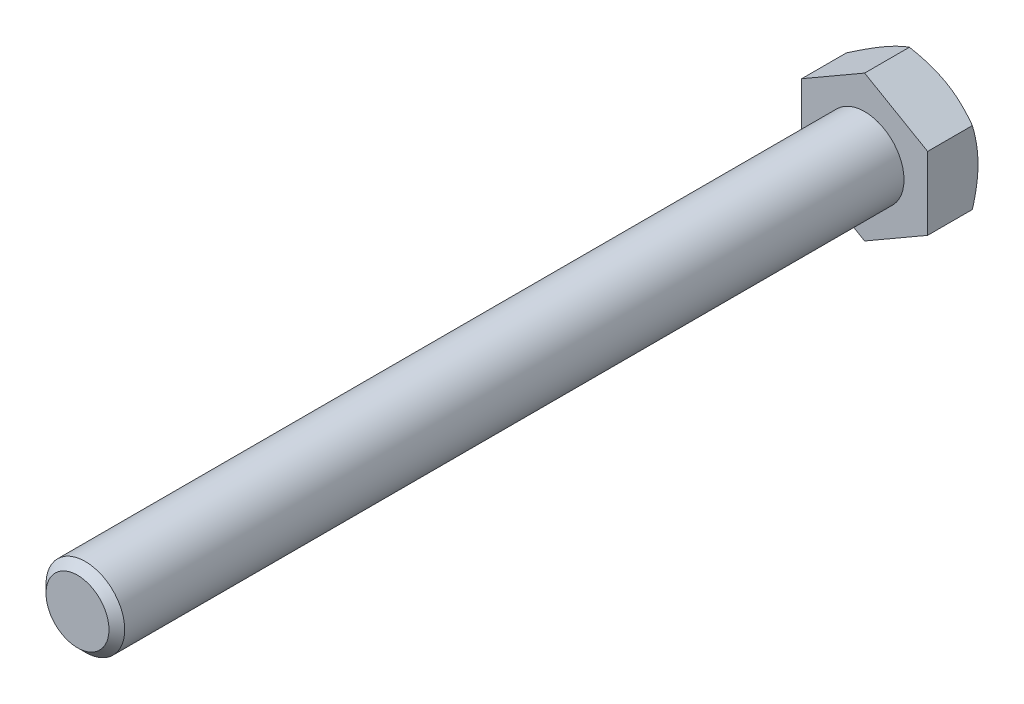
ISO-10303-21;
HEADER;
FILE_DESCRIPTION(('STEP AP214'),'2;1');
FILE_NAME('part.step','',(''),(''),'','','');
FILE_SCHEMA(('AUTOMOTIVE_DESIGN { 1 0 10303 214 1 1 1 1 }'));
ENDSEC;
DATA;
#1=APPLICATION_CONTEXT('core data for automotive mechanical design processes');
#2=APPLICATION_PROTOCOL_DEFINITION('international standard','automotive_design',2000,#1);
#3=PRODUCT_CONTEXT('',#1,'mechanical');
#4=PRODUCT('Part','Part','',(#3));
#5=PRODUCT_RELATED_PRODUCT_CATEGORY('part','',(#4));
#6=PRODUCT_DEFINITION_FORMATION('','',#4);
#7=PRODUCT_DEFINITION_CONTEXT('part definition',#1,'design');
#8=PRODUCT_DEFINITION('design','',#6,#7);
#9=PRODUCT_DEFINITION_SHAPE('','',#8);
#10=(LENGTH_UNIT() NAMED_UNIT(*) SI_UNIT(.MILLI.,.METRE.));
#11=(NAMED_UNIT(*) PLANE_ANGLE_UNIT() SI_UNIT($,.RADIAN.));
#12=(NAMED_UNIT(*) SI_UNIT($,.STERADIAN.) SOLID_ANGLE_UNIT());
#13=UNCERTAINTY_MEASURE_WITH_UNIT(LENGTH_MEASURE(1.E-05),#10,'distance_accuracy_value','');
#14=(GEOMETRIC_REPRESENTATION_CONTEXT(3) GLOBAL_UNCERTAINTY_ASSIGNED_CONTEXT((#13)) GLOBAL_UNIT_ASSIGNED_CONTEXT((#10,
#11,#12)) REPRESENTATION_CONTEXT('',''));
#15=CARTESIAN_POINT('',(0.,0.,0.));
#16=DIRECTION('',(0.,0.,1.));
#17=DIRECTION('',(1.,0.,0.));
#18=AXIS2_PLACEMENT_3D('',#15,#16,#17);
#19=CARTESIAN_POINT('',(0.,-1.2490009027033E-13,100.));
#20=DIRECTION('',(0.,0.,1.));
#21=DIRECTION('',(1.,0.,0.));
#22=AXIS2_PLACEMENT_3D('',#19,#20,#21);
#23=PLANE('',#22);
#24=CARTESIAN_POINT('',(0.,-1.2490009027033E-13,100.));
#25=DIRECTION('',(0.,0.,1.));
#26=DIRECTION('',(1.,0.,0.));
#27=AXIS2_PLACEMENT_3D('',#24,#25,#26);
#28=CIRCLE('',#27,3.99999999999998);
#29=CARTESIAN_POINT('',(4.00000000000006,-1.2490009027033E-13,100.));
#30=VERTEX_POINT('',#29);
#31=EDGE_CURVE('E205',#30,#30,#28,.T.);
#32=ORIENTED_EDGE('',*,*,#31,.T.);
#33=EDGE_LOOP('',(#32));
#34=FACE_BOUND('',#33,.T.);
#35=ADVANCED_FACE('F31',(#34),#23,.T.);
#36=CARTESIAN_POINT('',(0.,0.,0.));
#37=DIRECTION('',(0.,0.,1.));
#38=DIRECTION('',(1.,0.,0.));
#39=AXIS2_PLACEMENT_3D('',#36,#37,#38);
#40=CYLINDRICAL_SURFACE('',#39,5.);
#41=CARTESIAN_POINT('',(0.,-1.2490009027033E-13,99.));
#42=DIRECTION('',(0.,0.,1.));
#43=DIRECTION('',(1.,0.,0.));
#44=AXIS2_PLACEMENT_3D('',#41,#42,#43);
#45=CIRCLE('',#44,5.);
#46=CARTESIAN_POINT('',(5.00000000000008,-1.2490009027033E-13,99.));
#47=VERTEX_POINT('',#46);
#48=EDGE_CURVE('E207',#47,#47,#45,.F.);
#49=ORIENTED_EDGE('',*,*,#48,.T.);
#50=EDGE_LOOP('',(#49));
#51=FACE_BOUND('',#50,.T.);
#52=CARTESIAN_POINT('',(0.,0.,0.));
#53=DIRECTION('',(0.,0.,1.));
#54=DIRECTION('',(1.,0.,0.));
#55=AXIS2_PLACEMENT_3D('',#52,#53,#54);
#56=CIRCLE('',#55,5.);
#57=CARTESIAN_POINT('',(5.00000000000002,0.,0.));
#58=VERTEX_POINT('',#57);
#59=EDGE_CURVE('E208',#58,#58,#56,.F.);
#60=ORIENTED_EDGE('',*,*,#59,.F.);
#61=EDGE_LOOP('',(#60));
#62=FACE_BOUND('',#61,.T.);
#63=ADVANCED_FACE('F196',(#51,#62),#40,.T.);
#64=CARTESIAN_POINT('',(0.,-1.2490009027033E-13,100.));
#65=DIRECTION('',(0.,0.,-1.));
#66=DIRECTION('',(-1.,0.,0.));
#67=AXIS2_PLACEMENT_3D('',#64,#65,#66);
#68=CONICAL_SURFACE('',#67,3.99999999999998,0.785398163397457);
#69=ORIENTED_EDGE('',*,*,#48,.F.);
#70=EDGE_LOOP('',(#69));
#71=FACE_BOUND('',#70,.T.);
#72=ORIENTED_EDGE('',*,*,#31,.F.);
#73=EDGE_LOOP('',(#72));
#74=FACE_BOUND('',#73,.T.);
#75=ADVANCED_FACE('F201',(#71,#74),#68,.T.);
#76=CARTESIAN_POINT('',(0.,9.23760430703405,-6.4));
#77=DIRECTION('',(0.5,0.866025403784442,0.));
#78=DIRECTION('',(-0.866025403784443,0.499999999999999,0.));
#79=AXIS2_PLACEMENT_3D('',#76,#77,#78);
#80=PLANE('',#79);
#81=CARTESIAN_POINT('',(-0.000199999999939832,9.23771977708791,-5.68540215226701));
#82=CARTESIAN_POINT('',(0.175648783879935,9.13619343437815,-5.74400928595268));
#83=CARTESIAN_POINT('',(0.352153194306164,9.03428856550539,-5.79995659895269));
#84=CARTESIAN_POINT('',(0.706595462878481,8.82965122633297,-5.90579899497531));
#85=CARTESIAN_POINT('',(0.884533904692736,8.72691841905233,-5.95569146556891));
#86=CARTESIAN_POINT('',(1.42119823762267,8.41707512197077,-6.09530720279312));
#87=CARTESIAN_POINT('',(1.78204258223575,8.20874154247285,-6.17471882902161));
#88=CARTESIAN_POINT('',(2.32203917020408,7.89697436704786,-6.26783835370549));
#89=CARTESIAN_POINT('',(2.49957818964331,7.79447216638295,-6.29436541897085));
#90=CARTESIAN_POINT('',(2.85545911296023,7.58900421950648,-6.3388468251411));
#91=CARTESIAN_POINT('',(3.03380094449327,7.48603851506312,-6.3568019234854));
#92=CARTESIAN_POINT('',(3.39079168482362,7.27992981503517,-6.38368435150811));
#93=CARTESIAN_POINT('',(3.56944001360952,7.17678715432034,-6.39262192645374));
#94=CARTESIAN_POINT('',(3.92690170509742,6.97040655051487,-6.40127769603485));
#95=CARTESIAN_POINT('',(4.10571506253012,6.86716861046645,-6.40099617549715));
#96=CARTESIAN_POINT('',(4.44001336701696,6.67416139438134,-6.39185497473122));
#97=CARTESIAN_POINT('',(4.5955219043387,6.58437849849729,-6.38411039563262));
#98=CARTESIAN_POINT('',(4.90617476174053,6.40502298765179,-6.36179886514654));
#99=CARTESIAN_POINT('',(5.06131905656002,6.31545038727453,-6.34723145386183));
#100=CARTESIAN_POINT('',(5.52615131589485,6.04707935721957,-6.29363930947244));
#101=CARTESIAN_POINT('',(5.83501648718175,5.86875596743377,-6.24473135833083));
#102=CARTESIAN_POINT('',(6.45602322876033,5.51021755801479,-6.12246059676566));
#103=CARTESIAN_POINT('',(6.76808554211451,5.33004829739582,-6.04857947962397));
#104=CARTESIAN_POINT('',(7.38755648169481,4.972396583674,-5.880899858745));
#105=CARTESIAN_POINT('',(7.69497304089181,4.79490955046829,-5.78714073914552));
#106=CARTESIAN_POINT('',(8.00020000000009,4.61868668346324,-5.68540215226701));
#107=B_SPLINE_CURVE_WITH_KNOTS('',3,(#81,#82,#83,#84,#85,#86,#87,#88,#89,#90,#91,#92,#93,#94,
#95,#96,#97,#98,#99,#100,#101,#102,#103,#104,#105,#106),.UNSPECIFIED.,.F.,.F.,(4,2,2,2,2,2,2,2,
2,2,2,2,4),(0.,0.633973543721348,1.26821965714356,2.53934712434765,3.15934343977048,
3.77928496069783,4.39852133866765,5.01773858515594,5.55680239410248,6.09590254421147,
7.17487077411834,8.27776850154293,9.37850115249056),.UNSPECIFIED.);
#108=CARTESIAN_POINT('',(0.,9.23760430703405,-5.68546882018367));
#109=VERTEX_POINT('',#108);
#110=CARTESIAN_POINT('',(4.00000000000004,6.92820323027554,-6.4));
#111=VERTEX_POINT('',#110);
#112=EDGE_CURVE('E241',#109,#111,#107,.T.);
#113=ORIENTED_EDGE('',*,*,#112,.F.);
#114=DIRECTION('',(0.,0.,1.));
#115=VECTOR('',#114,1.);
#116=CARTESIAN_POINT('',(0.,9.23760430703405,-6.4));
#117=LINE('',#116,#115);
#118=CARTESIAN_POINT('',(0.,9.23760430703405,0.));
#119=VERTEX_POINT('',#118);
#120=EDGE_CURVE('E215',#109,#119,#117,.T.);
#121=ORIENTED_EDGE('',*,*,#120,.T.);
#122=DIRECTION('',(-0.866025403784443,0.499999999999999,0.));
#123=VECTOR('',#122,1.);
#124=CARTESIAN_POINT('',(0.,9.23760430703405,0.));
#125=LINE('',#124,#123);
#126=CARTESIAN_POINT('',(8.00000000000007,4.61880215351709,0.));
#127=VERTEX_POINT('',#126);
#128=EDGE_CURVE('E239',#127,#119,#125,.T.);
#129=ORIENTED_EDGE('',*,*,#128,.F.);
#130=DIRECTION('',(0.,0.,1.));
#131=VECTOR('',#130,1.);
#132=CARTESIAN_POINT('',(8.00000000000004,4.61880215351707,-6.39999999999999));
#133=LINE('',#132,#131);
#134=CARTESIAN_POINT('',(8.00000000000003,4.61880215351705,-5.68546882018366));
#135=VERTEX_POINT('',#134);
#136=EDGE_CURVE('E212',#135,#127,#133,.T.);
#137=ORIENTED_EDGE('',*,*,#136,.F.);
#138=EDGE_CURVE('E171',#111,#135,#107,.T.);
#139=ORIENTED_EDGE('',*,*,#138,.F.);
#140=EDGE_LOOP('',(#113,#121,#129,#137,#139));
#141=FACE_BOUND('',#140,.T.);
#142=ADVANCED_FACE('F181',(#141),#80,.T.);
#143=CARTESIAN_POINT('',(8.,-4.61880215351702,-6.39999999999992));
#144=DIRECTION('',(1.,0.,0.));
#145=DIRECTION('',(0.,0.,-1.));
#146=AXIS2_PLACEMENT_3D('',#143,#144,#145);
#147=PLANE('',#146);
#148=CARTESIAN_POINT('',(8.00000000000009,-12.5978512302027,-2.40281206496025));
#149=CARTESIAN_POINT('',(8.00000000000003,-12.246746193335,-2.57388946423494));
#150=CARTESIAN_POINT('',(8.00000000000001,-11.8948553361064,-2.74338074230881));
#151=CARTESIAN_POINT('',(7.99999999999999,-11.1890846886661,-3.07830251110038));
#152=CARTESIAN_POINT('',(8.,-10.835204611765,-3.24373239703251));
#153=CARTESIAN_POINT('',(8.,-10.1233054863219,-3.57043443638573));
#154=CARTESIAN_POINT('',(8.,-9.76527449682906,-3.73168065672867));
#155=CARTESIAN_POINT('',(8.,-9.04643054583632,-4.04782365286064));
#156=CARTESIAN_POINT('',(8.,-8.68561771136528,-4.20272071655814));
#157=CARTESIAN_POINT('',(8.,-7.94836823401665,-4.50960168843216));
#158=CARTESIAN_POINT('',(8.,-7.57181608867651,-4.66130959920928));
#159=CARTESIAN_POINT('',(8.,-6.8143786958222,-4.95369969756663));
#160=CARTESIAN_POINT('',(8.,-6.43349297805852,-5.0943806752572));
#161=CARTESIAN_POINT('',(7.99999999999999,-5.66743059798481,-5.36116349536506));
#162=CARTESIAN_POINT('',(7.99999999999998,-5.28226375872603,-5.48729325010826));
#163=CARTESIAN_POINT('',(8.00000000000002,-4.50642197899134,-5.72105487356285));
#164=CARTESIAN_POINT('',(8.00000000000007,-4.11574875302434,-5.82869236825172));
#165=CARTESIAN_POINT('',(8.00000000000007,-3.33076858815041,-6.01985550727007));
#166=CARTESIAN_POINT('',(8.00000000000001,-2.93649538955179,-6.10351603835958));
#167=CARTESIAN_POINT('',(7.99999999999999,-2.34134760728193,-6.20749259694592));
#168=CARTESIAN_POINT('',(8.,-2.14232908008158,-6.23856705157576));
#169=CARTESIAN_POINT('',(8.,-1.74323916388526,-6.29294025453344));
#170=CARTESIAN_POINT('',(8.,-1.5431678791364,-6.31623975857019));
#171=CARTESIAN_POINT('',(8.,-1.14493807260304,-6.35429623361987));
#172=CARTESIAN_POINT('',(8.,-0.946790216902606,-6.36916434005902));
#173=CARTESIAN_POINT('',(8.,-0.550042658772934,-6.39050002577556));
#174=CARTESIAN_POINT('',(8.,-0.351442964201984,-6.39696775004869));
#175=CARTESIAN_POINT('',(7.99999999999999,0.0458536813574681,-6.40134753654392));
#176=CARTESIAN_POINT('',(7.99999999999998,0.244550632880976,-6.39925955116046));
#177=CARTESIAN_POINT('',(8.00000000000001,0.641675332001835,-6.38658102386361));
#178=CARTESIAN_POINT('',(8.00000000000006,0.840103066876735,-6.37599009324409));
#179=CARTESIAN_POINT('',(8.00000000000008,1.31123186508482,-6.3409781073635));
#180=CARTESIAN_POINT('',(8.00000000000002,1.58366327386952,-6.31284309148416));
#181=CARTESIAN_POINT('',(7.99999999999998,2.12661564573494,-6.24203710559683));
#182=CARTESIAN_POINT('',(7.99999999999999,2.39713636619096,-6.1993643222489));
#183=CARTESIAN_POINT('',(8.00000000000001,3.20545284137287,-6.05179305178878));
#184=CARTESIAN_POINT('',(8.,3.73973646457266,-5.92736416459607));
#185=CARTESIAN_POINT('',(8.,4.53906436560802,-5.71012995228711));
#186=CARTESIAN_POINT('',(8.,4.80821183359779,-5.63154182973881));
#187=CARTESIAN_POINT('',(8.,5.34389592451212,-5.46584170055405));
#188=CARTESIAN_POINT('',(8.,5.61043252727899,-5.37872962816376));
#189=CARTESIAN_POINT('',(7.99999999999999,6.14097486865214,-5.19740915600457));
#190=CARTESIAN_POINT('',(7.99999999999998,6.40498129578467,-5.10320275237941));
#191=CARTESIAN_POINT('',(8.00000000000001,6.93077992716971,-4.90883812520454));
#192=CARTESIAN_POINT('',(8.00000000000006,7.1925721821315,-4.80868003838509));
#193=CARTESIAN_POINT('',(8.00000000000009,7.89757234436713,-4.53123135388026));
#194=CARTESIAN_POINT('',(8.00000000000002,8.33892089987198,-4.34922056511974));
#195=CARTESIAN_POINT('',(7.99999999999997,9.21706508189068,-3.97449001059298));
#196=CARTESIAN_POINT('',(7.99999999999999,9.65386019466895,-3.78176905166925));
#197=CARTESIAN_POINT('',(8.00000000000001,10.5239434374362,-3.38815487772953));
#198=CARTESIAN_POINT('',(8.,10.9572301479344,-3.18725853544569));
#199=CARTESIAN_POINT('',(8.,11.8208356781986,-2.77925077908642));
#200=CARTESIAN_POINT('',(8.,12.2511546186011,-2.57213961948964));
#201=CARTESIAN_POINT('',(8.,13.1101061451691,-2.15271844372303));
#202=CARTESIAN_POINT('',(8.,13.5387348916149,-1.9404005805941));
#203=CARTESIAN_POINT('',(8.,14.3940561255566,-1.51189757696327));
#204=CARTESIAN_POINT('',(8.,14.8207485968081,-1.29571240409163));
#205=CARTESIAN_POINT('',(8.,15.6724483801741,-0.86028346815875));
#206=CARTESIAN_POINT('',(8.,16.0974560462025,-0.641040396526408));
#207=CARTESIAN_POINT('',(8.,16.9461557859949,-0.200021087699503));
#208=CARTESIAN_POINT('',(8.,17.3698478544563,0.0217551596884403));
#209=CARTESIAN_POINT('',(8.,18.5495919939928,0.642968734562609));
#210=CARTESIAN_POINT('',(8.,19.3044430685455,1.04468640301358));
#211=CARTESIAN_POINT('',(8.,20.8116128705592,1.85294502935702));
#212=CARTESIAN_POINT('',(7.99999999999999,21.563931437839,2.25948628524755));
#213=CARTESIAN_POINT('',(8.,23.064082553762,3.07479055108809));
#214=CARTESIAN_POINT('',(8.,23.8119216778553,3.48354147008009));
#215=CARTESIAN_POINT('',(7.99999999999999,24.9325210040827,4.09870759670387));
#216=CARTESIAN_POINT('',(7.99999999999999,25.3058462727559,4.30409483812582));
#217=CARTESIAN_POINT('',(8.,26.0521604299717,4.71547851410467));
#218=CARTESIAN_POINT('',(8.00000000000002,26.4251493189334,4.92147494790111));
#219=CARTESIAN_POINT('',(8.00000000000007,26.7979906098644,5.12773824710108));
#220=B_SPLINE_CURVE_WITH_KNOTS('',3,(#148,#149,#150,#151,#152,#153,#154,#155,#156,#157,#158,
#159,#160,#161,#162,#163,#164,#165,#166,#167,#168,#169,#170,#171,#172,#173,#174,#175,#176,#177,
#178,#179,#180,#181,#182,#183,#184,#185,#186,#187,#188,#189,#190,#191,#192,#193,#194,#195,#196,
#197,#198,#199,#200,#201,#202,#203,#204,#205,#206,#207,#208,#209,#210,#211,#212,#213,#214,#215,
#216,#217,#218,#219),.UNSPECIFIED.,.F.,.F.,(4,2,2,2,2,2,2,2,2,2,2,2,2,2,2,2,2,2,2,2,2,2,2,2,2,2,
2,2,2,2,2,2,2,2,2,4),(0.,1.17171303757608,2.34359951048674,3.52154779988271,4.69944261487827,
5.91720060182579,7.13509201629463,8.35060698423298,9.56575149358515,10.7739194195453,
11.3780811947188,11.982184229517,12.5781274788068,13.1740604416141,13.7699967203082,
14.3659602433607,15.1871414998263,16.0084252222518,17.651791220792,18.4928743658415,
19.3339639995265,20.1748178523692,21.0156523954213,22.4476587813298,23.87982501976,
25.312544340616,26.7452050756368,28.1801767110294,29.6151603628914,31.0498246444422,
32.48449470105,35.0497345139727,37.6151336395593,40.171894300576,41.4501744055995,
42.7284529156065),.UNSPECIFIED.);
#221=CARTESIAN_POINT('',(7.99999999999999,0.,-6.4));
#222=VERTEX_POINT('',#221);
#223=EDGE_CURVE('E169',#135,#222,#220,.F.);
#224=ORIENTED_EDGE('',*,*,#223,.F.);
#225=ORIENTED_EDGE('',*,*,#136,.T.);
#226=DIRECTION('',(0.,1.,0.));
#227=VECTOR('',#226,1.);
#228=CARTESIAN_POINT('',(8.00000000000008,-4.61880215351705,0.));
#229=LINE('',#228,#227);
#230=CARTESIAN_POINT('',(8.00000000000008,-4.61880215351705,0.));
#231=VERTEX_POINT('',#230);
#232=EDGE_CURVE('E217',#231,#127,#229,.T.);
#233=ORIENTED_EDGE('',*,*,#232,.F.);
#234=DIRECTION('',(0.,0.,1.));
#235=VECTOR('',#234,1.);
#236=CARTESIAN_POINT('',(8.,-4.61880215351702,-6.39999999999992));
#237=LINE('',#236,#235);
#238=CARTESIAN_POINT('',(8.,-4.61880215351702,-5.68546882018359));
#239=VERTEX_POINT('',#238);
#240=EDGE_CURVE('E223',#239,#231,#237,.T.);
#241=ORIENTED_EDGE('',*,*,#240,.F.);
#242=EDGE_CURVE('E164',#222,#239,#220,.F.);
#243=ORIENTED_EDGE('',*,*,#242,.F.);
#244=EDGE_LOOP('',(#224,#225,#233,#241,#243));
#245=FACE_BOUND('',#244,.T.);
#246=ADVANCED_FACE('F177',(#245),#147,.T.);
#247=CARTESIAN_POINT('',(0.,-9.23760430703401,-6.39999999999993));
#248=DIRECTION('',(0.499999999999999,-0.866025403784442,0.));
#249=DIRECTION('',(0.866025403784443,0.499999999999999,0.));
#250=AXIS2_PLACEMENT_3D('',#247,#248,#249);
#251=PLANE('',#250);
#252=CARTESIAN_POINT('',(8.00020000000009,-4.61868668346313,-5.68540215226694));
#253=CARTESIAN_POINT('',(7.82435121612019,-4.72021302617284,-5.74400928595265));
#254=CARTESIAN_POINT('',(7.64784680569395,-4.82211789504558,-5.79995659895268));
#255=CARTESIAN_POINT('',(7.29340453712163,-5.02675523421799,-5.90579899497532));
#256=CARTESIAN_POINT('',(7.11546609530737,-5.12948804149864,-5.95569146556892));
#257=CARTESIAN_POINT('',(6.57880176237744,-5.43933133858021,-6.09530720279312));
#258=CARTESIAN_POINT('',(6.21795741776436,-5.64766491807812,-6.17471882902162));
#259=CARTESIAN_POINT('',(5.67796082979603,-5.95943209350311,-6.26783835370551));
#260=CARTESIAN_POINT('',(5.50042181035679,-6.06193429416802,-6.29436541897088));
#261=CARTESIAN_POINT('',(5.14454088703988,-6.26740224104449,-6.33884682514113));
#262=CARTESIAN_POINT('',(4.96619905550684,-6.37036794548786,-6.35680192348542));
#263=CARTESIAN_POINT('',(4.60920831517648,-6.5764766455158,-6.38368435150815));
#264=CARTESIAN_POINT('',(4.43055998639057,-6.67961930623062,-6.3926219264538));
#265=CARTESIAN_POINT('',(4.07309829490268,-6.88599991003612,-6.40127769603486));
#266=CARTESIAN_POINT('',(3.89428493746999,-6.98923785008458,-6.40099617549707));
#267=CARTESIAN_POINT('',(3.55998663298314,-7.1822450661697,-6.39185497473116));
#268=CARTESIAN_POINT('',(3.40447809566137,-7.27202796205371,-6.38411039563263));
#269=CARTESIAN_POINT('',(3.09382523825952,-7.4513834728992,-6.36179886514661));
#270=CARTESIAN_POINT('',(2.93868094344002,-7.54095607327647,-6.34723145386188));
#271=CARTESIAN_POINT('',(2.47384868410519,-7.80932710333146,-6.29363930947247));
#272=CARTESIAN_POINT('',(2.16498351281827,-7.98765049311726,-6.24473135833087));
#273=CARTESIAN_POINT('',(1.54397677123967,-8.34618890253623,-6.12246059676571));
#274=CARTESIAN_POINT('',(1.23191445788548,-8.52635816315521,-6.04857947962402));
#275=CARTESIAN_POINT('',(0.61244351830518,-8.88400987687705,-5.88089985874502));
#276=CARTESIAN_POINT('',(0.305026959108186,-9.0614969100828,-5.78714073914551));
#277=CARTESIAN_POINT('',(-0.000200000000047384,-9.23771977708791,-5.68540215226694));
#278=B_SPLINE_CURVE_WITH_KNOTS('',3,(#252,#253,#254,#255,#256,#257,#258,#259,#260,#261,#262,
#263,#264,#265,#266,#267,#268,#269,#270,#271,#272,#273,#274,#275,#276,#277),.UNSPECIFIED.,.F.,
.F.,(4,2,2,2,2,2,2,2,2,2,2,2,4),(0.,0.63397354372136,1.26821965714358,2.53934712434767,
3.15934343977051,3.77928496069786,4.39852133866769,5.01773858515599,5.55680239410255,
6.09590254421156,7.17487077411847,8.27776850154309,9.37850115249076),.UNSPECIFIED.);
#279=CARTESIAN_POINT('',(4.00000000000005,-6.92820323027551,-6.39999999999993));
#280=VERTEX_POINT('',#279);
#281=EDGE_CURVE('E170',#239,#280,#278,.T.);
#282=ORIENTED_EDGE('',*,*,#281,.F.);
#283=ORIENTED_EDGE('',*,*,#240,.T.);
#284=DIRECTION('',(0.866025403784443,0.499999999999999,0.));
#285=VECTOR('',#284,1.);
#286=CARTESIAN_POINT('',(0.,-9.23760430703401,0.));
#287=LINE('',#286,#285);
#288=CARTESIAN_POINT('',(0.,-9.23760430703401,0.));
#289=VERTEX_POINT('',#288);
#290=EDGE_CURVE('E228',#289,#231,#287,.T.);
#291=ORIENTED_EDGE('',*,*,#290,.F.);
#292=DIRECTION('',(0.,0.,1.));
#293=VECTOR('',#292,1.);
#294=CARTESIAN_POINT('',(0.,-9.23760430703401,-6.39999999999993));
#295=LINE('',#294,#293);
#296=CARTESIAN_POINT('',(0.,-9.23760430703401,-5.6854688201836));
#297=VERTEX_POINT('',#296);
#298=EDGE_CURVE('E221',#297,#289,#295,.T.);
#299=ORIENTED_EDGE('',*,*,#298,.F.);
#300=EDGE_CURVE('E158',#280,#297,#278,.T.);
#301=ORIENTED_EDGE('',*,*,#300,.F.);
#302=EDGE_LOOP('',(#282,#283,#291,#299,#301));
#303=FACE_BOUND('',#302,.T.);
#304=ADVANCED_FACE('F180',(#303),#251,.T.);
#305=CARTESIAN_POINT('',(0.,-9.23760430703401,-6.39999999999993));
#306=DIRECTION('',(-0.500000000000003,-0.86602540378444,0.));
#307=DIRECTION('',(0.866025403784441,-0.500000000000003,0.));
#308=AXIS2_PLACEMENT_3D('',#305,#306,#307);
#309=PLANE('',#308);
#310=CARTESIAN_POINT('',(0.000200000000024833,-9.23771977708782,-5.68540215226694));
#311=CARTESIAN_POINT('',(-0.17564878387988,-9.13619343437812,-5.74400928595266));
#312=CARTESIAN_POINT('',(-0.352153194306124,-9.03428856550539,-5.79995659895269));
#313=CARTESIAN_POINT('',(-0.706595462878457,-8.82965122633299,-5.90579899497533));
#314=CARTESIAN_POINT('',(-0.884533904692711,-8.72691841905234,-5.95569146556893));
#315=CARTESIAN_POINT('',(-1.42119823762264,-8.41707512197077,-6.09530720279313));
#316=CARTESIAN_POINT('',(-1.78204258223572,-8.20874154247285,-6.17471882902163));
#317=CARTESIAN_POINT('',(-2.32203917020405,-7.89697436704786,-6.26783835370551));
#318=CARTESIAN_POINT('',(-2.49957818964328,-7.79447216638295,-6.29436541897088));
#319=CARTESIAN_POINT('',(-2.8554591129602,-7.58900421950648,-6.33884682514112));
#320=CARTESIAN_POINT('',(-3.03380094449324,-7.4860385150631,-6.35680192348541));
#321=CARTESIAN_POINT('',(-3.3907916848236,-7.27992981503517,-6.38368435150814));
#322=CARTESIAN_POINT('',(-3.56944001360951,-7.17678715432036,-6.39262192645379));
#323=CARTESIAN_POINT('',(-3.92690170509739,-6.97040655051483,-6.40127769603485));
#324=CARTESIAN_POINT('',(-4.10571506253006,-6.86716861046634,-6.40099617549706));
#325=CARTESIAN_POINT('',(-4.44001336701691,-6.67416139438123,-6.39185497473115));
#326=CARTESIAN_POINT('',(-4.59552190433869,-6.58437849849724,-6.38411039563261));
#327=CARTESIAN_POINT('',(-4.90617476174054,-6.40502298765178,-6.3617988651466));
#328=CARTESIAN_POINT('',(-5.06131905656002,-6.31545038727451,-6.34723145386186));
#329=CARTESIAN_POINT('',(-5.52615131589483,-6.04707935721952,-6.29363930947245));
#330=CARTESIAN_POINT('',(-5.83501648718174,-5.86875596743373,-6.24473135833085));
#331=CARTESIAN_POINT('',(-6.45602322876031,-5.51021755801477,-6.12246059676569));
#332=CARTESIAN_POINT('',(-6.76808554211449,-5.33004829739579,-6.04857947962401));
#333=CARTESIAN_POINT('',(-7.38755648169476,-4.97239658367397,-5.88089985874502));
#334=CARTESIAN_POINT('',(-7.69497304089176,-4.79490955046824,-5.78714073914551));
#335=CARTESIAN_POINT('',(-8.0002,-4.61868668346319,-5.68540215226696));
#336=B_SPLINE_CURVE_WITH_KNOTS('',3,(#310,#311,#312,#313,#314,#315,#316,#317,#318,#319,#320,
#321,#322,#323,#324,#325,#326,#327,#328,#329,#330,#331,#332,#333,#334,#335),.UNSPECIFIED.,.F.,
.F.,(4,2,2,2,2,2,2,2,2,2,2,2,4),(0.,0.633973543721362,1.26821965714358,2.53934712434768,
3.15934343977051,3.77928496069786,4.39852133866769,5.01773858515599,5.55680239410253,
6.09590254421153,7.17487077411839,8.27776850154296,9.37850115249058),.UNSPECIFIED.);
#337=CARTESIAN_POINT('',(-4.00000000000003,-6.92820323027545,-6.39999999999993));
#338=VERTEX_POINT('',#337);
#339=EDGE_CURVE('E260',#297,#338,#336,.T.);
#340=ORIENTED_EDGE('',*,*,#339,.F.);
#341=ORIENTED_EDGE('',*,*,#298,.T.);
#342=DIRECTION('',(0.866025403784441,-0.500000000000003,0.));
#343=VECTOR('',#342,1.);
#344=CARTESIAN_POINT('',(0.,-9.23760430703401,0.));
#345=LINE('',#344,#343);
#346=CARTESIAN_POINT('',(-7.99999999999999,-4.6188021535169,0.));
#347=VERTEX_POINT('',#346);
#348=EDGE_CURVE('E231',#347,#289,#345,.T.);
#349=ORIENTED_EDGE('',*,*,#348,.F.);
#350=DIRECTION('',(0.,0.,1.));
#351=VECTOR('',#350,1.);
#352=CARTESIAN_POINT('',(-7.99999999999999,-4.6188021535169,-6.39999999999993));
#353=LINE('',#352,#351);
#354=CARTESIAN_POINT('',(-8.00000000000001,-4.61880215351731,-5.68546882018385));
#355=VERTEX_POINT('',#354);
#356=EDGE_CURVE('E219',#355,#347,#353,.T.);
#357=ORIENTED_EDGE('',*,*,#356,.F.);
#358=EDGE_CURVE('E107',#338,#355,#336,.T.);
#359=ORIENTED_EDGE('',*,*,#358,.F.);
#360=EDGE_LOOP('',(#340,#341,#349,#357,#359));
#361=FACE_BOUND('',#360,.T.);
#362=ADVANCED_FACE('F185',(#361),#309,.T.);
#363=CARTESIAN_POINT('',(-7.99999999999999,-4.6188021535169,-6.39999999999993));
#364=DIRECTION('',(-1.,0.,0.));
#365=DIRECTION('',(0.,0.,1.));
#366=AXIS2_PLACEMENT_3D('',#363,#364,#365);
#367=PLANE('',#366);
#368=CARTESIAN_POINT('',(-8.,-12.5978512302027,-2.40281206496026));
#369=CARTESIAN_POINT('',(-8.,-12.246746193335,-2.57388946423493));
#370=CARTESIAN_POINT('',(-7.99999999999999,-11.8948553361065,-2.74338074230879));
#371=CARTESIAN_POINT('',(-7.99999999999999,-11.1890846886661,-3.07830251110036));
#372=CARTESIAN_POINT('',(-7.99999999999999,-10.835204611765,-3.24373239703249));
#373=CARTESIAN_POINT('',(-7.99999999999999,-10.1233054863219,-3.57043443638571));
#374=CARTESIAN_POINT('',(-7.99999999999999,-9.76527449682909,-3.73168065672866));
#375=CARTESIAN_POINT('',(-7.99999999999999,-9.04643054583635,-4.04782365286062));
#376=CARTESIAN_POINT('',(-7.99999999999999,-8.68561771136531,-4.20272071655813));
#377=CARTESIAN_POINT('',(-7.99999999999999,-7.94836823401668,-4.50960168843215));
#378=CARTESIAN_POINT('',(-7.99999999999999,-7.57181608867653,-4.66130959920927));
#379=CARTESIAN_POINT('',(-7.99999999999999,-6.81437869582222,-4.95369969756662));
#380=CARTESIAN_POINT('',(-7.99999999999999,-6.43349297805853,-5.09438067525719));
#381=CARTESIAN_POINT('',(-7.99999999999999,-5.66743059798482,-5.36116349536506));
#382=CARTESIAN_POINT('',(-7.99999999999999,-5.28226375872603,-5.48729325010827));
#383=CARTESIAN_POINT('',(-8.,-4.50642197899132,-5.72105487356284));
#384=CARTESIAN_POINT('',(-8.,-4.1157487530243,-5.82869236825167));
#385=CARTESIAN_POINT('',(-8.,-3.33076858815038,-6.01985550727001));
#386=CARTESIAN_POINT('',(-7.99999999999999,-2.93649538955177,-6.10351603835957));
#387=CARTESIAN_POINT('',(-7.99999999999999,-2.34134760728193,-6.20749259694592));
#388=CARTESIAN_POINT('',(-7.99999999999999,-2.14232908008158,-6.23856705157576));
#389=CARTESIAN_POINT('',(-7.99999999999999,-1.74323916388527,-6.29294025453344));
#390=CARTESIAN_POINT('',(-7.99999999999999,-1.54316787913642,-6.31623975857019));
#391=CARTESIAN_POINT('',(-7.99999999999999,-1.14493807260306,-6.35429623361986));
#392=CARTESIAN_POINT('',(-8.,-0.946790216902637,-6.36916434005902));
#393=CARTESIAN_POINT('',(-7.99999999999999,-0.550042658772975,-6.39050002577556));
#394=CARTESIAN_POINT('',(-7.99999999999999,-0.351442964202032,-6.39696775004869));
#395=CARTESIAN_POINT('',(-8.,0.0458536813574103,-6.40134753654392));
#396=CARTESIAN_POINT('',(-8.00000000000001,0.244550632880913,-6.39925955116046));
#397=CARTESIAN_POINT('',(-7.99999999999998,0.641675332001763,-6.38658102386361));
#398=CARTESIAN_POINT('',(-7.99999999999994,0.840103066876657,-6.37599009324409));
#399=CARTESIAN_POINT('',(-7.99999999999993,1.31123186508474,-6.3409781073635));
#400=CARTESIAN_POINT('',(-7.99999999999998,1.58366327386944,-6.31284309148416));
#401=CARTESIAN_POINT('',(-8.00000000000001,2.12661564573486,-6.24203710559684));
#402=CARTESIAN_POINT('',(-8.,2.39713636619089,-6.19936432224891));
#403=CARTESIAN_POINT('',(-7.99999999999998,3.20545284137281,-6.05179305178879));
#404=CARTESIAN_POINT('',(-7.99999999999999,3.7397364645726,-5.92736416459609));
#405=CARTESIAN_POINT('',(-8.,4.53906436560797,-5.71012995228712));
#406=CARTESIAN_POINT('',(-8.,4.80821183359774,-5.63154182973882));
#407=CARTESIAN_POINT('',(-7.99999999999999,5.34389592451208,-5.46584170055406));
#408=CARTESIAN_POINT('',(-7.99999999999999,5.61043252727895,-5.37872962816377));
#409=CARTESIAN_POINT('',(-8.,6.14097486865211,-5.19740915600458));
#410=CARTESIAN_POINT('',(-8.00000000000001,6.40498129578465,-5.10320275237942));
#411=CARTESIAN_POINT('',(-7.99999999999998,6.93077992716969,-4.90883812520454));
#412=CARTESIAN_POINT('',(-7.99999999999994,7.19257218213148,-4.80868003838509));
#413=CARTESIAN_POINT('',(-7.9999999999999,7.89757234436711,-4.53123135388026));
#414=CARTESIAN_POINT('',(-7.99999999999997,8.33892089987198,-4.34922056511974));
#415=CARTESIAN_POINT('',(-8.00000000000002,9.21706508189069,-3.97449001059298));
#416=CARTESIAN_POINT('',(-8.,9.65386019466895,-3.78176905166925));
#417=CARTESIAN_POINT('',(-7.99999999999999,10.5239434374362,-3.38815487772952));
#418=CARTESIAN_POINT('',(-7.99999999999999,10.9572301479345,-3.18725853544568));
#419=CARTESIAN_POINT('',(-8.,11.8208356781986,-2.77925077908642));
#420=CARTESIAN_POINT('',(-7.99999999999999,12.2511546186011,-2.57213961948963));
#421=CARTESIAN_POINT('',(-7.99999999999999,13.1101061451692,-2.15271844372301));
#422=CARTESIAN_POINT('',(-8.,13.5387348916149,-1.94040058059408));
#423=CARTESIAN_POINT('',(-8.,14.3940561255566,-1.51189757696325));
#424=CARTESIAN_POINT('',(-8.,14.8207485968082,-1.29571240409161));
#425=CARTESIAN_POINT('',(-8.,15.6724483801741,-0.860283468158729));
#426=CARTESIAN_POINT('',(-8.,16.0974560462025,-0.641040396526385));
#427=CARTESIAN_POINT('',(-8.,16.946155785995,-0.200021087699478));
#428=CARTESIAN_POINT('',(-8.,17.3698478544564,0.0217551596884653));
#429=CARTESIAN_POINT('',(-8.,18.5495919939929,0.642968734562632));
#430=CARTESIAN_POINT('',(-8.,19.3044430685455,1.0446864030136));
#431=CARTESIAN_POINT('',(-8.,20.8116128705593,1.85294502935704));
#432=CARTESIAN_POINT('',(-8.,21.563931437839,2.25948628524756));
#433=CARTESIAN_POINT('',(-8.,23.064082553762,3.0747905510881));
#434=CARTESIAN_POINT('',(-8.,23.8119216778553,3.4835414700801));
#435=CARTESIAN_POINT('',(-7.99999999999999,24.9325210040827,4.09870759670388));
#436=CARTESIAN_POINT('',(-7.99999999999999,25.3058462727559,4.30409483812583));
#437=CARTESIAN_POINT('',(-8.,26.0521604299717,4.71547851410469));
#438=CARTESIAN_POINT('',(-8.00000000000001,26.4251493189334,4.92147494790114));
#439=CARTESIAN_POINT('',(-8.00000000000003,26.7979906098644,5.12773824710115));
#440=B_SPLINE_CURVE_WITH_KNOTS('',3,(#368,#369,#370,#371,#372,#373,#374,#375,#376,#377,#378,
#379,#380,#381,#382,#383,#384,#385,#386,#387,#388,#389,#390,#391,#392,#393,#394,#395,#396,#397,
#398,#399,#400,#401,#402,#403,#404,#405,#406,#407,#408,#409,#410,#411,#412,#413,#414,#415,#416,
#417,#418,#419,#420,#421,#422,#423,#424,#425,#426,#427,#428,#429,#430,#431,#432,#433,#434,#435,
#436,#437,#438,#439),.UNSPECIFIED.,.F.,.F.,(4,2,2,2,2,2,2,2,2,2,2,2,2,2,2,2,2,2,2,2,2,2,2,2,2,2,
2,2,2,2,2,2,2,2,2,4),(0.,1.17171303757609,2.34359951048675,3.52154779988272,4.69944261487828,
5.91720060182582,7.13509201629466,8.35060698423304,9.56575149358522,10.7739194195453,
11.3780811947189,11.9821842295171,12.5781274788068,13.1740604416141,13.7699967203082,
14.3659602433606,15.1871414998263,16.0084252222517,17.651791220792,18.4928743658415,
19.3339639995266,20.1748178523692,21.0156523954214,22.4476587813298,23.87982501976,
25.3125443406161,26.7452050756368,28.1801767110294,29.6151603628915,31.0498246444423,
32.4844947010501,35.0497345139728,37.6151336395594,40.171894300576,41.4501744055996,
42.7284529156065),.UNSPECIFIED.);
#441=CARTESIAN_POINT('',(-8.00000000000007,0.,-6.4));
#442=VERTEX_POINT('',#441);
#443=EDGE_CURVE('E102',#355,#442,#440,.T.);
#444=ORIENTED_EDGE('',*,*,#443,.F.);
#445=ORIENTED_EDGE('',*,*,#356,.T.);
#446=DIRECTION('',(0.,-1.,0.));
#447=VECTOR('',#446,1.);
#448=CARTESIAN_POINT('',(-7.99999999999999,-4.6188021535169,0.));
#449=LINE('',#448,#447);
#450=CARTESIAN_POINT('',(-8.,4.61880215351702,0.));
#451=VERTEX_POINT('',#450);
#452=EDGE_CURVE('E234',#451,#347,#449,.T.);
#453=ORIENTED_EDGE('',*,*,#452,.F.);
#454=DIRECTION('',(0.,0.,1.));
#455=VECTOR('',#454,1.);
#456=CARTESIAN_POINT('',(-8.00000000000006,4.61880215351708,-6.4));
#457=LINE('',#456,#455);
#458=CARTESIAN_POINT('',(-8.00000000000006,4.61880215351708,-5.68546882018367));
#459=VERTEX_POINT('',#458);
#460=EDGE_CURVE('E128',#459,#451,#457,.T.);
#461=ORIENTED_EDGE('',*,*,#460,.F.);
#462=EDGE_CURVE('E111',#442,#459,#440,.T.);
#463=ORIENTED_EDGE('',*,*,#462,.F.);
#464=EDGE_LOOP('',(#444,#445,#453,#461,#463));
#465=FACE_BOUND('',#464,.T.);
#466=ADVANCED_FACE('F126',(#465),#367,.T.);
#467=CARTESIAN_POINT('',(-8.00000000000006,4.61880215351708,-6.4));
#468=DIRECTION('',(-0.500000000000003,0.86602540378444,0.));
#469=DIRECTION('',(-0.866025403784441,-0.500000000000003,0.));
#470=AXIS2_PLACEMENT_3D('',#467,#468,#469);
#471=PLANE('',#470);
#472=CARTESIAN_POINT('',(-8.00019999999999,4.61868668346317,-5.68540215226702));
#473=CARTESIAN_POINT('',(-7.82435121612011,4.72021302617296,-5.74400928595267));
#474=CARTESIAN_POINT('',(-7.64784680569388,4.82211789504573,-5.79995659895266));
#475=CARTESIAN_POINT('',(-7.29340453712155,5.02675523421816,-5.90579899497528));
#476=CARTESIAN_POINT('',(-7.1154660953073,5.1294880414988,-5.95569146556888));
#477=CARTESIAN_POINT('',(-6.57880176237735,5.43933133858037,-6.09530720279309));
#478=CARTESIAN_POINT('',(-6.21795741776426,5.6476649180783,-6.17471882902158));
#479=CARTESIAN_POINT('',(-5.67796082979592,5.9594320935033,-6.26783835370546));
#480=CARTESIAN_POINT('',(-5.50042181035668,6.06193429416821,-6.29436541897082));
#481=CARTESIAN_POINT('',(-5.14454088703976,6.26740224104469,-6.33884682514107));
#482=CARTESIAN_POINT('',(-4.96619905550671,6.37036794548806,-6.35680192348537));
#483=CARTESIAN_POINT('',(-4.60920831517635,6.576476645516,-6.38368435150807));
#484=CARTESIAN_POINT('',(-4.43055998639044,6.67961930623083,-6.39262192645369));
#485=CARTESIAN_POINT('',(-4.07309829490255,6.88599991003633,-6.40127769603482));
#486=CARTESIAN_POINT('',(-3.89428493746985,6.98923785008478,-6.40099617549714));
#487=CARTESIAN_POINT('',(-3.55998663298302,7.1822450661699,-6.39185497473121));
#488=CARTESIAN_POINT('',(-3.40447809566127,7.27202796205391,-6.38411039563257));
#489=CARTESIAN_POINT('',(-3.09382523825944,7.45138347289939,-6.36179886514648));
#490=CARTESIAN_POINT('',(-2.93868094343996,7.54095607327665,-6.34723145386177));
#491=CARTESIAN_POINT('',(-2.47384868410515,7.80932710333162,-6.29363930947239));
#492=CARTESIAN_POINT('',(-2.16498351281825,7.98765049311741,-6.24473135833078));
#493=CARTESIAN_POINT('',(-1.54397677123969,8.34618890253637,-6.1224605967656));
#494=CARTESIAN_POINT('',(-1.23191445788553,8.52635816315535,-6.04857947962391));
#495=CARTESIAN_POINT('',(-0.612443518305256,8.88400987687716,-5.88089985874495));
#496=CARTESIAN_POINT('',(-0.305026959108266,9.06149691008288,-5.78714073914549));
#497=CARTESIAN_POINT('',(0.000199999999993608,9.23771977708794,-5.68540215226701));
#498=B_SPLINE_CURVE_WITH_KNOTS('',3,(#472,#473,#474,#475,#476,#477,#478,#479,#480,#481,#482,
#483,#484,#485,#486,#487,#488,#489,#490,#491,#492,#493,#494,#495,#496,#497),.UNSPECIFIED.,.F.,
.F.,(4,2,2,2,2,2,2,2,2,2,2,2,4),(0.,0.633973543721362,1.26821965714358,2.53934712434772,
3.15934343977056,3.77928496069793,4.39852133866776,5.01773858515607,5.55680239410258,
6.09590254421156,7.1748707741184,8.27776850154296,9.37850115249054),.UNSPECIFIED.);
#499=CARTESIAN_POINT('',(-4.00000000000002,6.92820323027556,-6.4));
#500=VERTEX_POINT('',#499);
#501=EDGE_CURVE('E117',#459,#500,#498,.T.);
#502=ORIENTED_EDGE('',*,*,#501,.F.);
#503=ORIENTED_EDGE('',*,*,#460,.T.);
#504=DIRECTION('',(-0.866025403784441,-0.500000000000003,0.));
#505=VECTOR('',#504,1.);
#506=CARTESIAN_POINT('',(-8.,4.61880215351702,0.));
#507=LINE('',#506,#505);
#508=EDGE_CURVE('E237',#119,#451,#507,.T.);
#509=ORIENTED_EDGE('',*,*,#508,.F.);
#510=ORIENTED_EDGE('',*,*,#120,.F.);
#511=EDGE_CURVE('E119',#500,#109,#498,.T.);
#512=ORIENTED_EDGE('',*,*,#511,.F.);
#513=EDGE_LOOP('',(#502,#503,#509,#510,#512));
#514=FACE_BOUND('',#513,.T.);
#515=ADVANCED_FACE('F193',(#514),#471,.T.);
#516=CARTESIAN_POINT('',(8.00000000000007,4.61880215351709,0.));
#517=DIRECTION('',(0.,0.,1.));
#518=DIRECTION('',(1.,0.,0.));
#519=AXIS2_PLACEMENT_3D('',#516,#517,#518);
#520=PLANE('',#519);
#521=ORIENTED_EDGE('',*,*,#59,.T.);
#522=EDGE_LOOP('',(#521));
#523=FACE_BOUND('',#522,.T.);
#524=ORIENTED_EDGE('',*,*,#128,.T.);
#525=ORIENTED_EDGE('',*,*,#508,.T.);
#526=ORIENTED_EDGE('',*,*,#452,.T.);
#527=ORIENTED_EDGE('',*,*,#348,.T.);
#528=ORIENTED_EDGE('',*,*,#290,.T.);
#529=ORIENTED_EDGE('',*,*,#232,.T.);
#530=EDGE_LOOP('',(#524,#525,#526,#527,#528,#529));
#531=FACE_BOUND('',#530,.T.);
#532=ADVANCED_FACE('F150',(#523,#531),#520,.T.);
#533=CARTESIAN_POINT('',(0.,0.,0.));
#534=DIRECTION('',(0.,0.,1.));
#535=DIRECTION('',(1.,0.,0.));
#536=AXIS2_PLACEMENT_3D('',#533,#534,#535);
#537=CONICAL_SURFACE('',#536,19.0851251684408,1.0471975511966);
#538=ORIENTED_EDGE('',*,*,#138,.T.);
#539=ORIENTED_EDGE('',*,*,#223,.T.);
#540=CARTESIAN_POINT('',(0.,0.,-6.4));
#541=DIRECTION('',(0.,0.,1.));
#542=DIRECTION('',(1.,0.,0.));
#543=AXIS2_PLACEMENT_3D('',#540,#541,#542);
#544=CIRCLE('',#543,8.);
#545=EDGE_CURVE('E34',#111,#222,#544,.F.);
#546=ORIENTED_EDGE('',*,*,#545,.F.);
#547=EDGE_LOOP('',(#538,#539,#546));
#548=FACE_BOUND('',#547,.T.);
#549=ADVANCED_FACE('F250',(#548),#537,.T.);
#550=ORIENTED_EDGE('',*,*,#112,.T.);
#551=EDGE_CURVE('E124',#500,#111,#544,.F.);
#552=ORIENTED_EDGE('',*,*,#551,.F.);
#553=ORIENTED_EDGE('',*,*,#511,.T.);
#554=EDGE_LOOP('',(#550,#552,#553));
#555=FACE_BOUND('',#554,.T.);
#556=ADVANCED_FACE('F149',(#555),#537,.T.);
#557=ORIENTED_EDGE('',*,*,#462,.T.);
#558=ORIENTED_EDGE('',*,*,#501,.T.);
#559=CARTESIAN_POINT('',(0.,0.,-6.4));
#560=DIRECTION('',(0.,0.,-1.));
#561=DIRECTION('',(-1.,0.,0.));
#562=AXIS2_PLACEMENT_3D('',#559,#560,#561);
#563=CIRCLE('',#562,8.);
#564=EDGE_CURVE('E52',#442,#500,#563,.T.);
#565=ORIENTED_EDGE('',*,*,#564,.F.);
#566=EDGE_LOOP('',(#557,#558,#565));
#567=FACE_BOUND('',#566,.T.);
#568=ADVANCED_FACE('F115',(#567),#537,.T.);
#569=ORIENTED_EDGE('',*,*,#358,.T.);
#570=ORIENTED_EDGE('',*,*,#443,.T.);
#571=EDGE_CURVE('E104',#338,#442,#544,.F.);
#572=ORIENTED_EDGE('',*,*,#571,.F.);
#573=EDGE_LOOP('',(#569,#570,#572));
#574=FACE_BOUND('',#573,.T.);
#575=ADVANCED_FACE('F103',(#574),#537,.T.);
#576=ORIENTED_EDGE('',*,*,#300,.T.);
#577=ORIENTED_EDGE('',*,*,#339,.T.);
#578=EDGE_CURVE('E39',#280,#338,#544,.F.);
#579=ORIENTED_EDGE('',*,*,#578,.F.);
#580=EDGE_LOOP('',(#576,#577,#579));
#581=FACE_BOUND('',#580,.T.);
#582=ADVANCED_FACE('F262',(#581),#537,.T.);
#583=ORIENTED_EDGE('',*,*,#242,.T.);
#584=ORIENTED_EDGE('',*,*,#281,.T.);
#585=EDGE_CURVE('E11',#222,#280,#544,.F.);
#586=ORIENTED_EDGE('',*,*,#585,.F.);
#587=EDGE_LOOP('',(#583,#584,#586));
#588=FACE_BOUND('',#587,.T.);
#589=ADVANCED_FACE('F257',(#588),#537,.T.);
#590=CARTESIAN_POINT('',(8.00000000000004,4.61880215351707,-6.39999999999999));
#591=DIRECTION('',(0.,0.,1.));
#592=DIRECTION('',(1.,0.,0.));
#593=AXIS2_PLACEMENT_3D('',#590,#591,#592);
#594=PLANE('',#593);
#595=ORIENTED_EDGE('',*,*,#545,.T.);
#596=ORIENTED_EDGE('',*,*,#585,.T.);
#597=ORIENTED_EDGE('',*,*,#578,.T.);
#598=ORIENTED_EDGE('',*,*,#571,.T.);
#599=ORIENTED_EDGE('',*,*,#564,.T.);
#600=ORIENTED_EDGE('',*,*,#551,.T.);
#601=EDGE_LOOP('',(#595,#596,#597,#598,#599,#600));
#602=FACE_BOUND('',#601,.T.);
#603=ADVANCED_FACE('F122',(#602),#594,.F.);
#604=CLOSED_SHELL('',(#35,#63,#75,#142,#246,#304,#362,#466,#515,#532,#549,#556,#568,#575,#582,
#589,#603));
#605=MANIFOLD_SOLID_BREP('B2',#604);
#606=ADVANCED_BREP_SHAPE_REPRESENTATION('',(#18,#605),#14);
#607=SHAPE_DEFINITION_REPRESENTATION(#9,#606);
ENDSEC;
END-ISO-10303-21;
